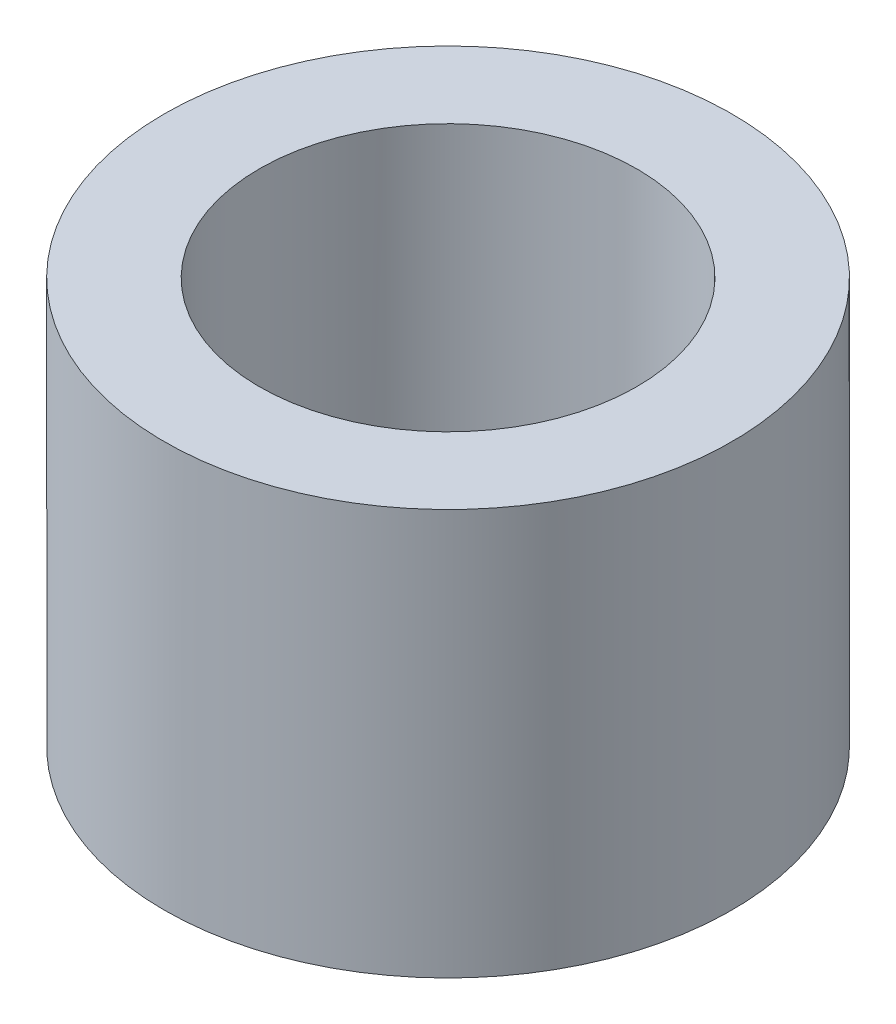
ISO-10303-21;
HEADER;
FILE_DESCRIPTION(('STEP AP214'),'2;1');
FILE_NAME('part.step','',(''),(''),'','','');
FILE_SCHEMA(('AUTOMOTIVE_DESIGN { 1 0 10303 214 1 1 1 1 }'));
ENDSEC;
DATA;
#1=APPLICATION_CONTEXT('core data for automotive mechanical design processes');
#2=APPLICATION_PROTOCOL_DEFINITION('international standard','automotive_design',2000,#1);
#3=PRODUCT_CONTEXT('',#1,'mechanical');
#4=PRODUCT('Part','Part','',(#3));
#5=PRODUCT_RELATED_PRODUCT_CATEGORY('part','',(#4));
#6=PRODUCT_DEFINITION_FORMATION('','',#4);
#7=PRODUCT_DEFINITION_CONTEXT('part definition',#1,'design');
#8=PRODUCT_DEFINITION('design','',#6,#7);
#9=PRODUCT_DEFINITION_SHAPE('','',#8);
#10=(LENGTH_UNIT() NAMED_UNIT(*) SI_UNIT(.MILLI.,.METRE.));
#11=(NAMED_UNIT(*) PLANE_ANGLE_UNIT() SI_UNIT($,.RADIAN.));
#12=(NAMED_UNIT(*) SI_UNIT($,.STERADIAN.) SOLID_ANGLE_UNIT());
#13=UNCERTAINTY_MEASURE_WITH_UNIT(LENGTH_MEASURE(1.E-05),#10,'distance_accuracy_value','');
#14=(GEOMETRIC_REPRESENTATION_CONTEXT(3) GLOBAL_UNCERTAINTY_ASSIGNED_CONTEXT((#13)) GLOBAL_UNIT_ASSIGNED_CONTEXT((#10,
#11,#12)) REPRESENTATION_CONTEXT('',''));
#15=CARTESIAN_POINT('',(0.,0.,0.));
#16=DIRECTION('',(0.,0.,1.));
#17=DIRECTION('',(1.,0.,0.));
#18=AXIS2_PLACEMENT_3D('',#15,#16,#17);
#19=CARTESIAN_POINT('',(0.,10.1653697603316,0.));
#20=DIRECTION('',(0.,-1.,0.));
#21=DIRECTION('',(0.,0.,-1.));
#22=AXIS2_PLACEMENT_3D('',#19,#20,#21);
#23=CYLINDRICAL_SURFACE('',#22,2.3875);
#24=CARTESIAN_POINT('',(0.,0.,0.));
#25=DIRECTION('',(0.,1.,0.));
#26=DIRECTION('',(0.,0.,1.));
#27=AXIS2_PLACEMENT_3D('',#24,#25,#26);
#28=CIRCLE('',#27,2.3875);
#29=CARTESIAN_POINT('',(0.,0.,2.3875));
#30=VERTEX_POINT('',#29);
#31=EDGE_CURVE('E40',#30,#30,#28,.T.);
#32=ORIENTED_EDGE('',*,*,#31,.T.);
#33=EDGE_LOOP('',(#32));
#34=FACE_BOUND('',#33,.T.);
#35=CARTESIAN_POINT('',(0.,3.41250000000012,0.));
#36=DIRECTION('',(0.,1.,0.));
#37=DIRECTION('',(-1.,0.,0.));
#38=AXIS2_PLACEMENT_3D('',#35,#36,#37);
#39=CIRCLE('',#38,2.3875);
#40=CARTESIAN_POINT('',(-2.3875,3.41250000000012,0.));
#41=VERTEX_POINT('',#40);
#42=EDGE_CURVE('E10',#41,#41,#39,.T.);
#43=ORIENTED_EDGE('',*,*,#42,.F.);
#44=EDGE_LOOP('',(#43));
#45=FACE_BOUND('',#44,.T.);
#46=ADVANCED_FACE('F37',(#34,#45),#23,.T.);
#47=CARTESIAN_POINT('',(0.,0.,0.));
#48=DIRECTION('',(0.,1.,0.));
#49=DIRECTION('',(0.,0.,1.));
#50=AXIS2_PLACEMENT_3D('',#47,#48,#49);
#51=PLANE('',#50);
#52=ORIENTED_EDGE('',*,*,#31,.F.);
#53=EDGE_LOOP('',(#52));
#54=FACE_BOUND('',#53,.T.);
#55=CARTESIAN_POINT('',(0.,0.,0.));
#56=DIRECTION('',(0.,1.,0.));
#57=DIRECTION('',(0.,0.,1.));
#58=AXIS2_PLACEMENT_3D('',#55,#56,#57);
#59=CIRCLE('',#58,1.5875);
#60=CARTESIAN_POINT('',(0.,0.,1.5875));
#61=VERTEX_POINT('',#60);
#62=EDGE_CURVE('E50',#61,#61,#59,.T.);
#63=ORIENTED_EDGE('',*,*,#62,.T.);
#64=EDGE_LOOP('',(#63));
#65=FACE_BOUND('',#64,.T.);
#66=ADVANCED_FACE('F59',(#54,#65),#51,.F.);
#67=CARTESIAN_POINT('',(0.,10.1653697603316,0.));
#68=DIRECTION('',(0.,-1.,0.));
#69=DIRECTION('',(0.,0.,-1.));
#70=AXIS2_PLACEMENT_3D('',#67,#68,#69);
#71=CYLINDRICAL_SURFACE('',#70,1.5875);
#72=ORIENTED_EDGE('',*,*,#62,.F.);
#73=EDGE_LOOP('',(#72));
#74=FACE_BOUND('',#73,.T.);
#75=CARTESIAN_POINT('',(0.,3.41250000000012,0.));
#76=DIRECTION('',(0.,1.,0.));
#77=DIRECTION('',(0.0132302544901332,0.,-0.999912476352869));
#78=AXIS2_PLACEMENT_3D('',#75,#76,#77);
#79=CIRCLE('',#78,1.5875);
#80=CARTESIAN_POINT('',(0.0210030290030786,3.41250000000012,-1.58736105621017));
#81=VERTEX_POINT('',#80);
#82=EDGE_CURVE('E44',#81,#81,#79,.T.);
#83=ORIENTED_EDGE('',*,*,#82,.T.);
#84=EDGE_LOOP('',(#83));
#85=FACE_BOUND('',#84,.T.);
#86=ADVANCED_FACE('F61',(#74,#85),#71,.F.);
#87=CARTESIAN_POINT('',(-6.04842239791194,3.41250000000011,1.05235108334205));
#88=DIRECTION('',(0.,1.,0.));
#89=DIRECTION('',(0.0132302544901332,0.,-0.999912476352869));
#90=AXIS2_PLACEMENT_3D('',#87,#88,#89);
#91=PLANE('',#90);
#92=ORIENTED_EDGE('',*,*,#82,.F.);
#93=EDGE_LOOP('',(#92));
#94=FACE_BOUND('',#93,.T.);
#95=ORIENTED_EDGE('',*,*,#42,.T.);
#96=EDGE_LOOP('',(#95));
#97=FACE_BOUND('',#96,.T.);
#98=ADVANCED_FACE('F66',(#94,#97),#91,.T.);
#99=CLOSED_SHELL('',(#46,#66,#86,#98));
#100=MANIFOLD_SOLID_BREP('B2',#99);
#101=ADVANCED_BREP_SHAPE_REPRESENTATION('',(#18,#100),#14);
#102=SHAPE_DEFINITION_REPRESENTATION(#9,#101);
ENDSEC;
END-ISO-10303-21;
